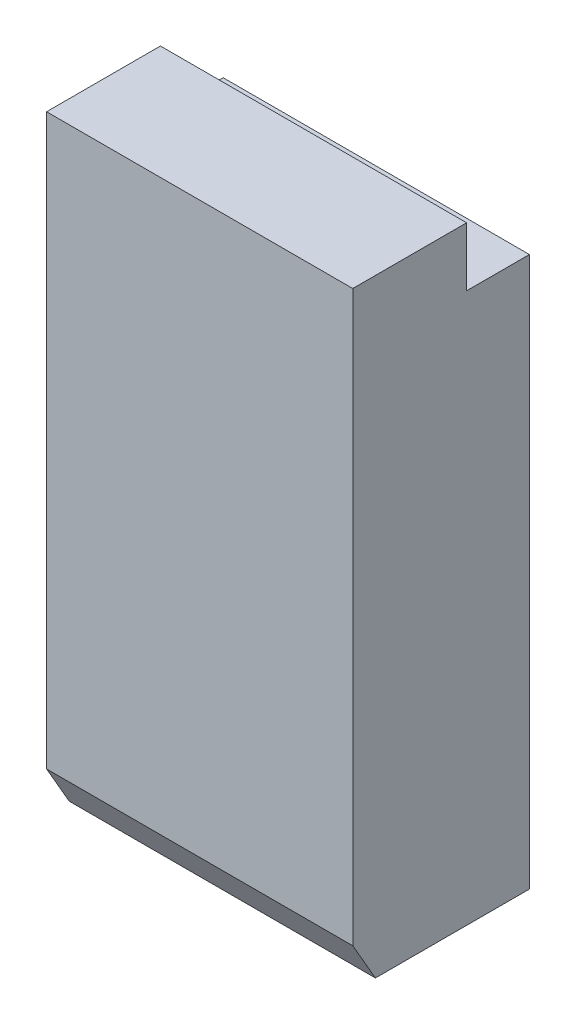
ISO-10303-21;
HEADER;
FILE_DESCRIPTION(('STEP AP214'),'2;1');
FILE_NAME('part.step','',(''),(''),'','','');
FILE_SCHEMA(('AUTOMOTIVE_DESIGN { 1 0 10303 214 1 1 1 1 }'));
ENDSEC;
DATA;
#1=APPLICATION_CONTEXT('core data for automotive mechanical design processes');
#2=APPLICATION_PROTOCOL_DEFINITION('international standard','automotive_design',2000,#1);
#3=PRODUCT_CONTEXT('',#1,'mechanical');
#4=PRODUCT('Part','Part','',(#3));
#5=PRODUCT_RELATED_PRODUCT_CATEGORY('part','',(#4));
#6=PRODUCT_DEFINITION_FORMATION('','',#4);
#7=PRODUCT_DEFINITION_CONTEXT('part definition',#1,'design');
#8=PRODUCT_DEFINITION('design','',#6,#7);
#9=PRODUCT_DEFINITION_SHAPE('','',#8);
#10=(LENGTH_UNIT() NAMED_UNIT(*) SI_UNIT(.MILLI.,.METRE.));
#11=(NAMED_UNIT(*) PLANE_ANGLE_UNIT() SI_UNIT($,.RADIAN.));
#12=(NAMED_UNIT(*) SI_UNIT($,.STERADIAN.) SOLID_ANGLE_UNIT());
#13=UNCERTAINTY_MEASURE_WITH_UNIT(LENGTH_MEASURE(1.E-05),#10,'distance_accuracy_value','');
#14=(GEOMETRIC_REPRESENTATION_CONTEXT(3) GLOBAL_UNCERTAINTY_ASSIGNED_CONTEXT((#13)) GLOBAL_UNIT_ASSIGNED_CONTEXT((#10,
#11,#12)) REPRESENTATION_CONTEXT('',''));
#15=CARTESIAN_POINT('',(0.,0.,0.));
#16=DIRECTION('',(0.,0.,1.));
#17=DIRECTION('',(1.,0.,0.));
#18=AXIS2_PLACEMENT_3D('',#15,#16,#17);
#19=CARTESIAN_POINT('',(3.9,-14.,-4.5));
#20=DIRECTION('',(0.,1.,0.));
#21=DIRECTION('',(0.,0.,1.));
#22=AXIS2_PLACEMENT_3D('',#19,#20,#21);
#23=PLANE('',#22);
#24=DIRECTION('',(0.,0.,-1.));
#25=VECTOR('',#24,1.);
#26=CARTESIAN_POINT('',(3.9,-14.,-4.5));
#27=LINE('',#26,#25);
#28=CARTESIAN_POINT('',(3.9,-14.,-0.577350269189629));
#29=VERTEX_POINT('',#28);
#30=CARTESIAN_POINT('',(3.9,-14.,-4.5));
#31=VERTEX_POINT('',#30);
#32=EDGE_CURVE('E95',#29,#31,#27,.T.);
#33=ORIENTED_EDGE('',*,*,#32,.F.);
#34=DIRECTION('',(-1.,0.,0.));
#35=VECTOR('',#34,1.);
#36=CARTESIAN_POINT('',(3.9,-14.,-0.577350269189629));
#37=LINE('',#36,#35);
#38=CARTESIAN_POINT('',(-3.9,-14.,-0.577350269189629));
#39=VERTEX_POINT('',#38);
#40=EDGE_CURVE('E112',#29,#39,#37,.T.);
#41=ORIENTED_EDGE('',*,*,#40,.T.);
#42=DIRECTION('',(0.,0.,-1.));
#43=VECTOR('',#42,1.);
#44=CARTESIAN_POINT('',(-3.9,-14.,-4.5));
#45=LINE('',#44,#43);
#46=CARTESIAN_POINT('',(-3.9,-14.,-4.5));
#47=VERTEX_POINT('',#46);
#48=EDGE_CURVE('E109',#39,#47,#45,.T.);
#49=ORIENTED_EDGE('',*,*,#48,.T.);
#50=DIRECTION('',(-1.,0.,0.));
#51=VECTOR('',#50,1.);
#52=CARTESIAN_POINT('',(3.9,-14.,-4.5));
#53=LINE('',#52,#51);
#54=EDGE_CURVE('E108',#31,#47,#53,.T.);
#55=ORIENTED_EDGE('',*,*,#54,.F.);
#56=EDGE_LOOP('',(#33,#41,#49,#55));
#57=FACE_BOUND('',#56,.T.);
#58=ADVANCED_FACE('F38',(#57),#23,.F.);
#59=CARTESIAN_POINT('',(3.9,0.,-4.5));
#60=DIRECTION('',(0.,0.,1.));
#61=DIRECTION('',(0.,-1.,0.));
#62=AXIS2_PLACEMENT_3D('',#59,#60,#61);
#63=PLANE('',#62);
#64=DIRECTION('',(0.,1.,0.));
#65=VECTOR('',#64,1.);
#66=CARTESIAN_POINT('',(-3.9,0.,-4.5));
#67=LINE('',#66,#65);
#68=CARTESIAN_POINT('',(-3.9,0.,-4.5));
#69=VERTEX_POINT('',#68);
#70=EDGE_CURVE('E130',#47,#69,#67,.T.);
#71=ORIENTED_EDGE('',*,*,#70,.T.);
#72=DIRECTION('',(-1.,0.,0.));
#73=VECTOR('',#72,1.);
#74=CARTESIAN_POINT('',(3.9,0.,-4.5));
#75=LINE('',#74,#73);
#76=CARTESIAN_POINT('',(3.9,0.,-4.5));
#77=VERTEX_POINT('',#76);
#78=EDGE_CURVE('E113',#77,#69,#75,.T.);
#79=ORIENTED_EDGE('',*,*,#78,.F.);
#80=DIRECTION('',(0.,1.,0.));
#81=VECTOR('',#80,1.);
#82=CARTESIAN_POINT('',(3.9,0.,-4.5));
#83=LINE('',#82,#81);
#84=EDGE_CURVE('E99',#31,#77,#83,.T.);
#85=ORIENTED_EDGE('',*,*,#84,.F.);
#86=ORIENTED_EDGE('',*,*,#54,.T.);
#87=EDGE_LOOP('',(#71,#79,#85,#86));
#88=FACE_BOUND('',#87,.T.);
#89=ADVANCED_FACE('F115',(#88),#63,.F.);
#90=CARTESIAN_POINT('',(3.9,0.,-2.9));
#91=DIRECTION('',(0.,-1.,0.));
#92=DIRECTION('',(0.,0.,-1.));
#93=AXIS2_PLACEMENT_3D('',#90,#91,#92);
#94=PLANE('',#93);
#95=DIRECTION('',(0.,0.,1.));
#96=VECTOR('',#95,1.);
#97=CARTESIAN_POINT('',(-3.9,0.,-2.9));
#98=LINE('',#97,#96);
#99=CARTESIAN_POINT('',(-3.9,0.,-2.9));
#100=VERTEX_POINT('',#99);
#101=EDGE_CURVE('E132',#69,#100,#98,.T.);
#102=ORIENTED_EDGE('',*,*,#101,.T.);
#103=DIRECTION('',(-1.,0.,0.));
#104=VECTOR('',#103,1.);
#105=CARTESIAN_POINT('',(3.9,0.,-2.9));
#106=LINE('',#105,#104);
#107=CARTESIAN_POINT('',(3.9,0.,-2.9));
#108=VERTEX_POINT('',#107);
#109=EDGE_CURVE('E145',#108,#100,#106,.T.);
#110=ORIENTED_EDGE('',*,*,#109,.F.);
#111=DIRECTION('',(0.,0.,1.));
#112=VECTOR('',#111,1.);
#113=CARTESIAN_POINT('',(3.9,0.,-2.9));
#114=LINE('',#113,#112);
#115=EDGE_CURVE('E118',#77,#108,#114,.T.);
#116=ORIENTED_EDGE('',*,*,#115,.F.);
#117=ORIENTED_EDGE('',*,*,#78,.T.);
#118=EDGE_LOOP('',(#102,#110,#116,#117));
#119=FACE_BOUND('',#118,.T.);
#120=ADVANCED_FACE('F155',(#119),#94,.F.);
#121=CARTESIAN_POINT('',(3.9,1.5,-2.9));
#122=DIRECTION('',(0.,0.,1.));
#123=DIRECTION('',(1.,0.,0.));
#124=AXIS2_PLACEMENT_3D('',#121,#122,#123);
#125=PLANE('',#124);
#126=DIRECTION('',(0.,1.,0.));
#127=VECTOR('',#126,1.);
#128=CARTESIAN_POINT('',(-3.9,1.5,-2.9));
#129=LINE('',#128,#127);
#130=CARTESIAN_POINT('',(-3.9,1.5,-2.9));
#131=VERTEX_POINT('',#130);
#132=EDGE_CURVE('E134',#100,#131,#129,.T.);
#133=ORIENTED_EDGE('',*,*,#132,.T.);
#134=DIRECTION('',(-1.,0.,0.));
#135=VECTOR('',#134,1.);
#136=CARTESIAN_POINT('',(3.9,1.5,-2.9));
#137=LINE('',#136,#135);
#138=CARTESIAN_POINT('',(3.9,1.5,-2.9));
#139=VERTEX_POINT('',#138);
#140=EDGE_CURVE('E142',#139,#131,#137,.T.);
#141=ORIENTED_EDGE('',*,*,#140,.F.);
#142=DIRECTION('',(0.,1.,0.));
#143=VECTOR('',#142,1.);
#144=CARTESIAN_POINT('',(3.9,1.5,-2.9));
#145=LINE('',#144,#143);
#146=EDGE_CURVE('E120',#108,#139,#145,.T.);
#147=ORIENTED_EDGE('',*,*,#146,.F.);
#148=ORIENTED_EDGE('',*,*,#109,.T.);
#149=EDGE_LOOP('',(#133,#141,#147,#148));
#150=FACE_BOUND('',#149,.T.);
#151=ADVANCED_FACE('F162',(#150),#125,.F.);
#152=CARTESIAN_POINT('',(3.9,1.5,0.));
#153=DIRECTION('',(0.,-1.,0.));
#154=DIRECTION('',(0.,0.,-1.));
#155=AXIS2_PLACEMENT_3D('',#152,#153,#154);
#156=PLANE('',#155);
#157=DIRECTION('',(0.,0.,1.));
#158=VECTOR('',#157,1.);
#159=CARTESIAN_POINT('',(-3.9,1.5,0.));
#160=LINE('',#159,#158);
#161=CARTESIAN_POINT('',(-3.9,1.5,0.));
#162=VERTEX_POINT('',#161);
#163=EDGE_CURVE('E136',#131,#162,#160,.T.);
#164=ORIENTED_EDGE('',*,*,#163,.T.);
#165=DIRECTION('',(-1.,0.,0.));
#166=VECTOR('',#165,1.);
#167=CARTESIAN_POINT('',(3.9,1.5,0.));
#168=LINE('',#167,#166);
#169=CARTESIAN_POINT('',(3.9,1.5,0.));
#170=VERTEX_POINT('',#169);
#171=EDGE_CURVE('E128',#170,#162,#168,.T.);
#172=ORIENTED_EDGE('',*,*,#171,.F.);
#173=DIRECTION('',(0.,0.,1.));
#174=VECTOR('',#173,1.);
#175=CARTESIAN_POINT('',(3.9,1.5,0.));
#176=LINE('',#175,#174);
#177=EDGE_CURVE('E125',#139,#170,#176,.T.);
#178=ORIENTED_EDGE('',*,*,#177,.F.);
#179=ORIENTED_EDGE('',*,*,#140,.T.);
#180=EDGE_LOOP('',(#164,#172,#178,#179));
#181=FACE_BOUND('',#180,.T.);
#182=ADVANCED_FACE('F165',(#181),#156,.F.);
#183=CARTESIAN_POINT('',(3.9,0.,0.));
#184=DIRECTION('',(0.,0.,-1.));
#185=DIRECTION('',(0.,1.,0.));
#186=AXIS2_PLACEMENT_3D('',#183,#184,#185);
#187=PLANE('',#186);
#188=DIRECTION('',(0.,-1.,0.));
#189=VECTOR('',#188,1.);
#190=CARTESIAN_POINT('',(-3.9,0.,0.));
#191=LINE('',#190,#189);
#192=CARTESIAN_POINT('',(-3.9,-13.0000000000003,-1.76652673970309E-13));
#193=VERTEX_POINT('',#192);
#194=EDGE_CURVE('E138',#162,#193,#191,.T.);
#195=ORIENTED_EDGE('',*,*,#194,.T.);
#196=DIRECTION('',(1.,0.,0.));
#197=VECTOR('',#196,1.);
#198=CARTESIAN_POINT('',(3.9,-13.0000000000003,-1.76652673970309E-13));
#199=LINE('',#198,#197);
#200=CARTESIAN_POINT('',(3.9,-13.0000000000003,0.));
#201=VERTEX_POINT('',#200);
#202=EDGE_CURVE('E46',#193,#201,#199,.T.);
#203=ORIENTED_EDGE('',*,*,#202,.T.);
#204=DIRECTION('',(0.,-1.,0.));
#205=VECTOR('',#204,1.);
#206=CARTESIAN_POINT('',(3.9,-14.,0.));
#207=LINE('',#206,#205);
#208=EDGE_CURVE('E105',#170,#201,#207,.T.);
#209=ORIENTED_EDGE('',*,*,#208,.F.);
#210=ORIENTED_EDGE('',*,*,#171,.T.);
#211=EDGE_LOOP('',(#195,#203,#209,#210));
#212=FACE_BOUND('',#211,.T.);
#213=ADVANCED_FACE('F166',(#212),#187,.F.);
#214=CARTESIAN_POINT('',(3.9,0.,0.));
#215=DIRECTION('',(-1.,0.,0.));
#216=DIRECTION('',(0.,0.,1.));
#217=AXIS2_PLACEMENT_3D('',#214,#215,#216);
#218=PLANE('',#217);
#219=ORIENTED_EDGE('',*,*,#208,.T.);
#220=DIRECTION('',(0.,0.866025403784433,0.500000000000009));
#221=VECTOR('',#220,1.);
#222=CARTESIAN_POINT('',(3.9,-14.,-0.577350269189629));
#223=LINE('',#222,#221);
#224=EDGE_CURVE('E11',#201,#29,#223,.F.);
#225=ORIENTED_EDGE('',*,*,#224,.T.);
#226=ORIENTED_EDGE('',*,*,#32,.T.);
#227=ORIENTED_EDGE('',*,*,#84,.T.);
#228=ORIENTED_EDGE('',*,*,#115,.T.);
#229=ORIENTED_EDGE('',*,*,#146,.T.);
#230=ORIENTED_EDGE('',*,*,#177,.T.);
#231=EDGE_LOOP('',(#219,#225,#226,#227,#228,#229,#230));
#232=FACE_BOUND('',#231,.T.);
#233=ADVANCED_FACE('F97',(#232),#218,.F.);
#234=CARTESIAN_POINT('',(-3.9,0.,0.));
#235=DIRECTION('',(-1.,0.,0.));
#236=DIRECTION('',(0.,0.,1.));
#237=AXIS2_PLACEMENT_3D('',#234,#235,#236);
#238=PLANE('',#237);
#239=ORIENTED_EDGE('',*,*,#48,.F.);
#240=DIRECTION('',(0.,-0.866025403784433,-0.500000000000009));
#241=VECTOR('',#240,1.);
#242=CARTESIAN_POINT('',(-3.9,-3.25000000000013,5.62916512459893));
#243=LINE('',#242,#241);
#244=EDGE_CURVE('E60',#39,#193,#243,.F.);
#245=ORIENTED_EDGE('',*,*,#244,.T.);
#246=ORIENTED_EDGE('',*,*,#194,.F.);
#247=ORIENTED_EDGE('',*,*,#163,.F.);
#248=ORIENTED_EDGE('',*,*,#132,.F.);
#249=ORIENTED_EDGE('',*,*,#101,.F.);
#250=ORIENTED_EDGE('',*,*,#70,.F.);
#251=EDGE_LOOP('',(#239,#245,#246,#247,#248,#249,#250));
#252=FACE_BOUND('',#251,.T.);
#253=ADVANCED_FACE('F151',(#252),#238,.T.);
#254=CARTESIAN_POINT('',(3.9,-14.,-0.577350269189629));
#255=DIRECTION('',(0.,0.500000000000009,-0.866025403784433));
#256=DIRECTION('',(-1.,0.,0.));
#257=AXIS2_PLACEMENT_3D('',#254,#255,#256);
#258=PLANE('',#257);
#259=ORIENTED_EDGE('',*,*,#224,.F.);
#260=ORIENTED_EDGE('',*,*,#202,.F.);
#261=ORIENTED_EDGE('',*,*,#244,.F.);
#262=ORIENTED_EDGE('',*,*,#40,.F.);
#263=EDGE_LOOP('',(#259,#260,#261,#262));
#264=FACE_BOUND('',#263,.T.);
#265=ADVANCED_FACE('F40',(#264),#258,.F.);
#266=CLOSED_SHELL('',(#58,#89,#120,#151,#182,#213,#233,#253,#265));
#267=MANIFOLD_SOLID_BREP('B2',#266);
#268=ADVANCED_BREP_SHAPE_REPRESENTATION('',(#18,#267),#14);
#269=SHAPE_DEFINITION_REPRESENTATION(#9,#268);
ENDSEC;
END-ISO-10303-21;
